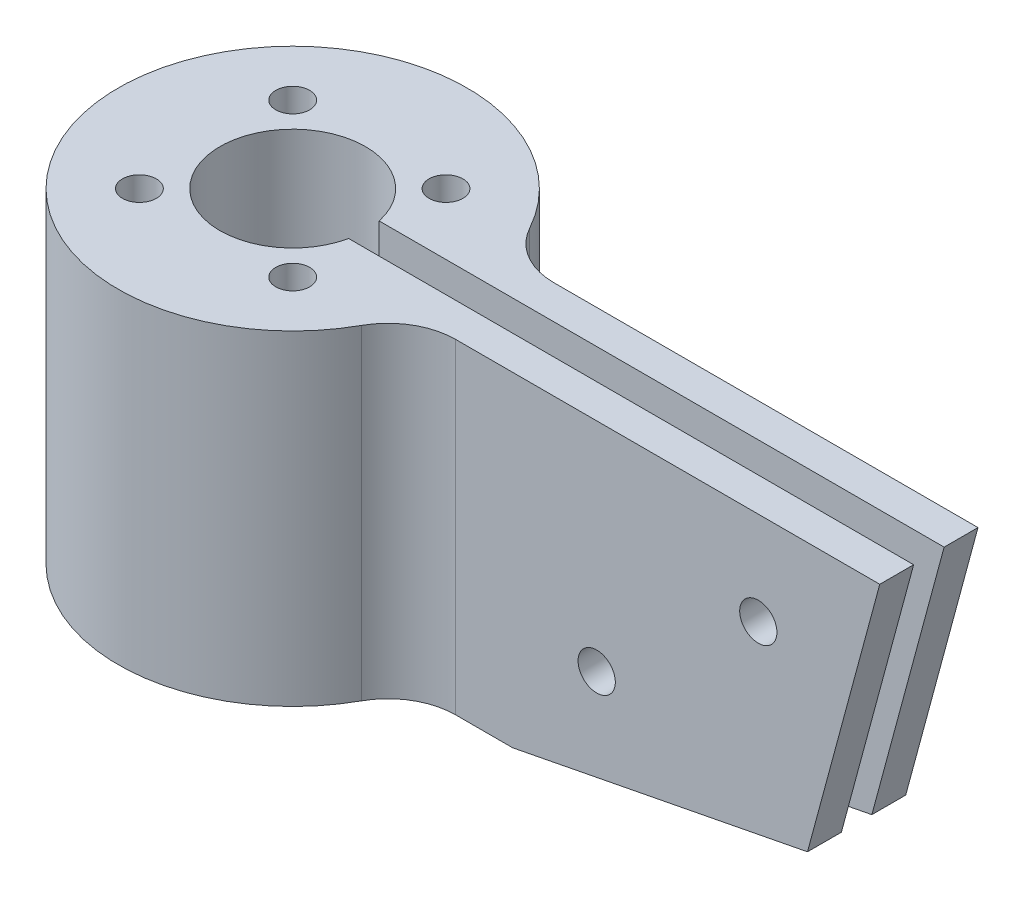
ISO-10303-21;
HEADER;
FILE_DESCRIPTION(('STEP AP214'),'2;1');
FILE_NAME('part.step','',(''),(''),'','','');
FILE_SCHEMA(('AUTOMOTIVE_DESIGN { 1 0 10303 214 1 1 1 1 }'));
ENDSEC;
DATA;
#1=APPLICATION_CONTEXT('core data for automotive mechanical design processes');
#2=APPLICATION_PROTOCOL_DEFINITION('international standard','automotive_design',2000,#1);
#3=PRODUCT_CONTEXT('',#1,'mechanical');
#4=PRODUCT('Part','Part','',(#3));
#5=PRODUCT_RELATED_PRODUCT_CATEGORY('part','',(#4));
#6=PRODUCT_DEFINITION_FORMATION('','',#4);
#7=PRODUCT_DEFINITION_CONTEXT('part definition',#1,'design');
#8=PRODUCT_DEFINITION('design','',#6,#7);
#9=PRODUCT_DEFINITION_SHAPE('','',#8);
#10=(LENGTH_UNIT() NAMED_UNIT(*) SI_UNIT(.MILLI.,.METRE.));
#11=(NAMED_UNIT(*) PLANE_ANGLE_UNIT() SI_UNIT($,.RADIAN.));
#12=(NAMED_UNIT(*) SI_UNIT($,.STERADIAN.) SOLID_ANGLE_UNIT());
#13=UNCERTAINTY_MEASURE_WITH_UNIT(LENGTH_MEASURE(1.E-05),#10,'distance_accuracy_value','');
#14=(GEOMETRIC_REPRESENTATION_CONTEXT(3) GLOBAL_UNCERTAINTY_ASSIGNED_CONTEXT((#13)) GLOBAL_UNIT_ASSIGNED_CONTEXT((#10,
#11,#12)) REPRESENTATION_CONTEXT('',''));
#15=CARTESIAN_POINT('',(0.,0.,0.));
#16=DIRECTION('',(0.,0.,1.));
#17=DIRECTION('',(1.,0.,0.));
#18=AXIS2_PLACEMENT_3D('',#15,#16,#17);
#19=CARTESIAN_POINT('',(0.,48.,0.));
#20=DIRECTION('',(0.,-1.,0.));
#21=DIRECTION('',(0.,0.,-1.));
#22=AXIS2_PLACEMENT_3D('',#19,#20,#21);
#23=CYLINDRICAL_SURFACE('',#22,10.75);
#24=CARTESIAN_POINT('',(0.,0.,0.));
#25=DIRECTION('',(0.,-1.,0.));
#26=DIRECTION('',(0.,0.,1.));
#27=AXIS2_PLACEMENT_3D('',#24,#25,#26);
#28=CIRCLE('',#27,10.75);
#29=CARTESIAN_POINT('',(10.5118980208143,0.,2.25));
#30=VERTEX_POINT('',#29);
#31=CARTESIAN_POINT('',(10.5118980208143,0.,-2.25));
#32=VERTEX_POINT('',#31);
#33=EDGE_CURVE('E198',#30,#32,#28,.T.);
#34=ORIENTED_EDGE('',*,*,#33,.T.);
#35=DIRECTION('',(0.,-1.,0.));
#36=VECTOR('',#35,1.);
#37=CARTESIAN_POINT('',(10.5118980208143,48.,-2.25));
#38=LINE('',#37,#36);
#39=CARTESIAN_POINT('',(10.5118980208143,48.,-2.25));
#40=VERTEX_POINT('',#39);
#41=EDGE_CURVE('E232',#40,#32,#38,.T.);
#42=ORIENTED_EDGE('',*,*,#41,.F.);
#43=CARTESIAN_POINT('',(0.,48.,0.));
#44=DIRECTION('',(0.,-1.,0.));
#45=DIRECTION('',(0.,0.,1.));
#46=AXIS2_PLACEMENT_3D('',#43,#44,#45);
#47=CIRCLE('',#46,10.75);
#48=CARTESIAN_POINT('',(10.5118980208143,48.,2.25));
#49=VERTEX_POINT('',#48);
#50=EDGE_CURVE('E130',#49,#40,#47,.T.);
#51=ORIENTED_EDGE('',*,*,#50,.F.);
#52=DIRECTION('',(0.,-1.,0.));
#53=VECTOR('',#52,1.);
#54=CARTESIAN_POINT('',(10.5118980208143,48.,2.25));
#55=LINE('',#54,#53);
#56=EDGE_CURVE('E211',#49,#30,#55,.T.);
#57=ORIENTED_EDGE('',*,*,#56,.T.);
#58=EDGE_LOOP('',(#34,#42,#51,#57));
#59=FACE_BOUND('',#58,.T.);
#60=ADVANCED_FACE('F35',(#59),#23,.F.);
#61=CARTESIAN_POINT('',(10.5118980208143,48.,-2.25));
#62=DIRECTION('',(0.,0.,-1.));
#63=DIRECTION('',(-1.,0.,0.));
#64=AXIS2_PLACEMENT_3D('',#61,#62,#63);
#65=PLANE('',#64);
#66=CARTESIAN_POINT('',(52.1236564536874,15.9580690922241,-2.25));
#67=DIRECTION('',(0.,0.,-1.));
#68=DIRECTION('',(-1.,0.,0.));
#69=AXIS2_PLACEMENT_3D('',#66,#67,#68);
#70=CIRCLE('',#69,2.75);
#71=CARTESIAN_POINT('',(49.3736564536874,15.9580690922241,-2.25));
#72=VERTEX_POINT('',#71);
#73=EDGE_CURVE('E255',#72,#72,#70,.T.);
#74=ORIENTED_EDGE('',*,*,#73,.T.);
#75=EDGE_LOOP('',(#74));
#76=FACE_BOUND('',#75,.T.);
#77=CARTESIAN_POINT('',(75.9780501365719,34.250087131701,-2.25));
#78=DIRECTION('',(0.,0.,-1.));
#79=DIRECTION('',(-1.,0.,0.));
#80=AXIS2_PLACEMENT_3D('',#77,#78,#79);
#81=CIRCLE('',#80,2.75000000000001);
#82=CARTESIAN_POINT('',(73.2280501365719,34.250087131701,-2.25));
#83=VERTEX_POINT('',#82);
#84=EDGE_CURVE('E155',#83,#83,#81,.T.);
#85=ORIENTED_EDGE('',*,*,#84,.T.);
#86=EDGE_LOOP('',(#85));
#87=FACE_BOUND('',#86,.T.);
#88=DIRECTION('',(1.,0.,0.));
#89=VECTOR('',#88,1.);
#90=CARTESIAN_POINT('',(10.5118980208143,0.,-2.25));
#91=LINE('',#90,#89);
#92=CARTESIAN_POINT('',(39.7082982012117,0.,-2.25));
#93=VERTEX_POINT('',#92);
#94=EDGE_CURVE('E214',#32,#93,#91,.T.);
#95=ORIENTED_EDGE('',*,*,#94,.T.);
#96=DIRECTION('',(-0.981627183447664,-0.190808995376546,0.));
#97=VECTOR('',#96,1.);
#98=CARTESIAN_POINT('',(1.44570260836241,-7.43749515974958,-2.25));
#99=LINE('',#98,#97);
#100=CARTESIAN_POINT('',(83.239372469083,8.46158367328585,-2.25));
#101=VERTEX_POINT('',#100);
#102=EDGE_CURVE('E144',#101,#93,#99,.T.);
#103=ORIENTED_EDGE('',*,*,#102,.F.);
#104=DIRECTION('',(-0.260538306569262,-0.965463510864093,0.));
#105=VECTOR('',#104,1.);
#106=CARTESIAN_POINT('',(75.4606377651394,-20.3636766741913,-2.25));
#107=LINE('',#106,#105);
#108=CARTESIAN_POINT('',(93.909140842797,48.,-2.24999999999999));
#109=VERTEX_POINT('',#108);
#110=EDGE_CURVE('E140',#109,#101,#107,.T.);
#111=ORIENTED_EDGE('',*,*,#110,.F.);
#112=DIRECTION('',(1.,0.,0.));
#113=VECTOR('',#112,1.);
#114=CARTESIAN_POINT('',(10.5118980208143,48.,-2.25));
#115=LINE('',#114,#113);
#116=EDGE_CURVE('E124',#40,#109,#115,.T.);
#117=ORIENTED_EDGE('',*,*,#116,.F.);
#118=ORIENTED_EDGE('',*,*,#41,.T.);
#119=EDGE_LOOP('',(#95,#103,#111,#117,#118));
#120=FACE_BOUND('',#119,.T.);
#121=ADVANCED_FACE('F147',(#76,#87,#120),#65,.F.);
#122=CARTESIAN_POINT('',(39.7082982012117,48.,-7.25));
#123=DIRECTION('',(0.,0.,1.));
#124=DIRECTION('',(1.,0.,0.));
#125=AXIS2_PLACEMENT_3D('',#122,#123,#124);
#126=PLANE('',#125);
#127=CARTESIAN_POINT('',(52.1236564536874,15.9580690922241,-7.25));
#128=DIRECTION('',(0.,0.,-1.));
#129=DIRECTION('',(-1.,0.,0.));
#130=AXIS2_PLACEMENT_3D('',#127,#128,#129);
#131=CIRCLE('',#130,2.75);
#132=CARTESIAN_POINT('',(49.3736564536874,15.9580690922241,-7.25));
#133=VERTEX_POINT('',#132);
#134=EDGE_CURVE('E265',#133,#133,#131,.T.);
#135=ORIENTED_EDGE('',*,*,#134,.F.);
#136=EDGE_LOOP('',(#135));
#137=FACE_BOUND('',#136,.T.);
#138=CARTESIAN_POINT('',(75.9780501365719,34.250087131701,-7.25));
#139=DIRECTION('',(0.,0.,-1.));
#140=DIRECTION('',(-1.,0.,0.));
#141=AXIS2_PLACEMENT_3D('',#138,#139,#140);
#142=CIRCLE('',#141,2.75000000000001);
#143=CARTESIAN_POINT('',(73.2280501365719,34.250087131701,-7.25));
#144=VERTEX_POINT('',#143);
#145=EDGE_CURVE('E250',#144,#144,#142,.T.);
#146=ORIENTED_EDGE('',*,*,#145,.F.);
#147=EDGE_LOOP('',(#146));
#148=FACE_BOUND('',#147,.T.);
#149=DIRECTION('',(-1.,0.,0.));
#150=VECTOR('',#149,1.);
#151=CARTESIAN_POINT('',(39.7082982012117,0.,-7.25));
#152=LINE('',#151,#150);
#153=CARTESIAN_POINT('',(39.7082982012117,0.,-7.25));
#154=VERTEX_POINT('',#153);
#155=CARTESIAN_POINT('',(31.3129366237023,0.,-7.25));
#156=VERTEX_POINT('',#155);
#157=EDGE_CURVE('E219',#154,#156,#152,.T.);
#158=ORIENTED_EDGE('',*,*,#157,.T.);
#159=DIRECTION('',(0.,1.,0.));
#160=VECTOR('',#159,1.);
#161=CARTESIAN_POINT('',(31.3129366237023,48.,-7.25));
#162=LINE('',#161,#160);
#163=CARTESIAN_POINT('',(31.3129366237023,48.,-7.25));
#164=VERTEX_POINT('',#163);
#165=EDGE_CURVE('E52',#156,#164,#162,.T.);
#166=ORIENTED_EDGE('',*,*,#165,.T.);
#167=DIRECTION('',(-1.,0.,0.));
#168=VECTOR('',#167,1.);
#169=CARTESIAN_POINT('',(39.7082982012117,48.,-7.25));
#170=LINE('',#169,#168);
#171=CARTESIAN_POINT('',(93.909140842797,48.,-7.24999999999999));
#172=VERTEX_POINT('',#171);
#173=EDGE_CURVE('E135',#172,#164,#170,.T.);
#174=ORIENTED_EDGE('',*,*,#173,.F.);
#175=DIRECTION('',(-0.260538306569262,-0.965463510864093,0.));
#176=VECTOR('',#175,1.);
#177=CARTESIAN_POINT('',(75.4606377651394,-20.3636766741913,-7.25));
#178=LINE('',#177,#176);
#179=CARTESIAN_POINT('',(83.239372469083,8.46158367328585,-7.25));
#180=VERTEX_POINT('',#179);
#181=EDGE_CURVE('E142',#172,#180,#178,.T.);
#182=ORIENTED_EDGE('',*,*,#181,.T.);
#183=DIRECTION('',(-0.981627183447664,-0.190808995376546,0.));
#184=VECTOR('',#183,1.);
#185=CARTESIAN_POINT('',(1.44570260836241,-7.43749515974958,-7.25));
#186=LINE('',#185,#184);
#187=EDGE_CURVE('E149',#180,#154,#186,.T.);
#188=ORIENTED_EDGE('',*,*,#187,.T.);
#189=EDGE_LOOP('',(#158,#166,#174,#182,#188));
#190=FACE_BOUND('',#189,.T.);
#191=ADVANCED_FACE('F306',(#137,#148,#190),#126,.F.);
#192=CARTESIAN_POINT('',(0.,48.,0.));
#193=DIRECTION('',(0.,-1.,0.));
#194=DIRECTION('',(0.,0.,-1.));
#195=AXIS2_PLACEMENT_3D('',#192,#193,#194);
#196=CYLINDRICAL_SURFACE('',#195,25.75);
#197=CARTESIAN_POINT('',(0.,0.,0.));
#198=DIRECTION('',(0.,1.,0.));
#199=DIRECTION('',(0.,0.,1.));
#200=AXIS2_PLACEMENT_3D('',#197,#198,#199);
#201=CIRCLE('',#200,25.75);
#202=CARTESIAN_POINT('',(22.5540732324569,0.,-12.4248251748252));
#203=VERTEX_POINT('',#202);
#204=CARTESIAN_POINT('',(22.5540732324569,0.,12.4248251748252));
#205=VERTEX_POINT('',#204);
#206=EDGE_CURVE('E221',#203,#205,#201,.T.);
#207=ORIENTED_EDGE('',*,*,#206,.T.);
#208=DIRECTION('',(0.,-1.,0.));
#209=VECTOR('',#208,1.);
#210=CARTESIAN_POINT('',(22.5540732324569,48.,12.4248251748252));
#211=LINE('',#210,#209);
#212=CARTESIAN_POINT('',(22.5540732324569,48.,12.4248251748252));
#213=VERTEX_POINT('',#212);
#214=EDGE_CURVE('E240',#205,#213,#211,.F.);
#215=ORIENTED_EDGE('',*,*,#214,.T.);
#216=CARTESIAN_POINT('',(0.,48.,0.));
#217=DIRECTION('',(0.,1.,0.));
#218=DIRECTION('',(0.,0.,1.));
#219=AXIS2_PLACEMENT_3D('',#216,#217,#218);
#220=CIRCLE('',#219,25.75);
#221=CARTESIAN_POINT('',(22.5540732324569,48.,-12.4248251748252));
#222=VERTEX_POINT('',#221);
#223=EDGE_CURVE('E204',#222,#213,#220,.T.);
#224=ORIENTED_EDGE('',*,*,#223,.F.);
#225=DIRECTION('',(0.,-1.,0.));
#226=VECTOR('',#225,1.);
#227=CARTESIAN_POINT('',(22.5540732324569,48.,-12.4248251748252));
#228=LINE('',#227,#226);
#229=EDGE_CURVE('E237',#222,#203,#228,.T.);
#230=ORIENTED_EDGE('',*,*,#229,.T.);
#231=EDGE_LOOP('',(#207,#215,#224,#230));
#232=FACE_BOUND('',#231,.T.);
#233=ADVANCED_FACE('F285',(#232),#196,.T.);
#234=CARTESIAN_POINT('',(39.7082982012117,48.,7.25));
#235=DIRECTION('',(0.,0.,-1.));
#236=DIRECTION('',(-1.,0.,0.));
#237=AXIS2_PLACEMENT_3D('',#234,#235,#236);
#238=PLANE('',#237);
#239=CARTESIAN_POINT('',(52.1236564536874,15.9580690922241,7.25));
#240=DIRECTION('',(0.,0.,-1.));
#241=DIRECTION('',(-1.,0.,0.));
#242=AXIS2_PLACEMENT_3D('',#239,#240,#241);
#243=CIRCLE('',#242,2.75);
#244=CARTESIAN_POINT('',(49.3736564536874,15.9580690922241,7.25));
#245=VERTEX_POINT('',#244);
#246=EDGE_CURVE('E260',#245,#245,#243,.T.);
#247=ORIENTED_EDGE('',*,*,#246,.T.);
#248=EDGE_LOOP('',(#247));
#249=FACE_BOUND('',#248,.T.);
#250=CARTESIAN_POINT('',(75.9780501365719,34.250087131701,7.25));
#251=DIRECTION('',(0.,0.,-1.));
#252=DIRECTION('',(-1.,0.,0.));
#253=AXIS2_PLACEMENT_3D('',#250,#251,#252);
#254=CIRCLE('',#253,2.75000000000001);
#255=CARTESIAN_POINT('',(73.2280501365719,34.250087131701,7.25));
#256=VERTEX_POINT('',#255);
#257=EDGE_CURVE('E249',#256,#256,#254,.T.);
#258=ORIENTED_EDGE('',*,*,#257,.T.);
#259=EDGE_LOOP('',(#258));
#260=FACE_BOUND('',#259,.T.);
#261=DIRECTION('',(1.,0.,0.));
#262=VECTOR('',#261,1.);
#263=CARTESIAN_POINT('',(39.7082982012117,48.,7.25));
#264=LINE('',#263,#262);
#265=CARTESIAN_POINT('',(31.3129366237023,48.,7.25));
#266=VERTEX_POINT('',#265);
#267=CARTESIAN_POINT('',(93.909140842797,48.,7.25));
#268=VERTEX_POINT('',#267);
#269=EDGE_CURVE('E207',#266,#268,#264,.T.);
#270=ORIENTED_EDGE('',*,*,#269,.F.);
#271=DIRECTION('',(0.,1.,0.));
#272=VECTOR('',#271,1.);
#273=CARTESIAN_POINT('',(31.3129366237023,0.,7.25));
#274=LINE('',#273,#272);
#275=CARTESIAN_POINT('',(31.3129366237023,0.,7.25));
#276=VERTEX_POINT('',#275);
#277=EDGE_CURVE('E234',#266,#276,#274,.F.);
#278=ORIENTED_EDGE('',*,*,#277,.T.);
#279=DIRECTION('',(1.,0.,0.));
#280=VECTOR('',#279,1.);
#281=CARTESIAN_POINT('',(39.7082982012117,0.,7.25));
#282=LINE('',#281,#280);
#283=CARTESIAN_POINT('',(39.7082982012117,0.,7.25));
#284=VERTEX_POINT('',#283);
#285=EDGE_CURVE('E224',#276,#284,#282,.T.);
#286=ORIENTED_EDGE('',*,*,#285,.T.);
#287=DIRECTION('',(0.981627183447664,0.190808995376546,0.));
#288=VECTOR('',#287,1.);
#289=CARTESIAN_POINT('',(39.7082982012117,0.,7.25));
#290=LINE('',#289,#288);
#291=CARTESIAN_POINT('',(83.239372469083,8.46158367328585,7.25));
#292=VERTEX_POINT('',#291);
#293=EDGE_CURVE('E159',#284,#292,#290,.T.);
#294=ORIENTED_EDGE('',*,*,#293,.T.);
#295=DIRECTION('',(0.260538306569262,0.965463510864093,0.));
#296=VECTOR('',#295,1.);
#297=CARTESIAN_POINT('',(83.239372469083,8.46158367328585,7.25));
#298=LINE('',#297,#296);
#299=EDGE_CURVE('E167',#292,#268,#298,.T.);
#300=ORIENTED_EDGE('',*,*,#299,.T.);
#301=EDGE_LOOP('',(#270,#278,#286,#294,#300));
#302=FACE_BOUND('',#301,.T.);
#303=ADVANCED_FACE('F282',(#249,#260,#302),#238,.F.);
#304=CARTESIAN_POINT('',(10.5118980208143,48.,2.25));
#305=DIRECTION('',(0.,0.,1.));
#306=DIRECTION('',(1.,0.,0.));
#307=AXIS2_PLACEMENT_3D('',#304,#305,#306);
#308=PLANE('',#307);
#309=CARTESIAN_POINT('',(52.1236564536874,15.9580690922241,2.25));
#310=DIRECTION('',(0.,0.,1.));
#311=DIRECTION('',(1.,0.,0.));
#312=AXIS2_PLACEMENT_3D('',#309,#310,#311);
#313=CIRCLE('',#312,2.75);
#314=CARTESIAN_POINT('',(54.8736564536874,15.9580690922241,2.25));
#315=VERTEX_POINT('',#314);
#316=EDGE_CURVE('E39',#315,#315,#313,.T.);
#317=ORIENTED_EDGE('',*,*,#316,.T.);
#318=EDGE_LOOP('',(#317));
#319=FACE_BOUND('',#318,.T.);
#320=CARTESIAN_POINT('',(75.9780501365719,34.250087131701,2.25));
#321=DIRECTION('',(0.,0.,1.));
#322=DIRECTION('',(1.,0.,0.));
#323=AXIS2_PLACEMENT_3D('',#320,#321,#322);
#324=CIRCLE('',#323,2.75000000000001);
#325=CARTESIAN_POINT('',(78.7280501365719,34.250087131701,2.25));
#326=VERTEX_POINT('',#325);
#327=EDGE_CURVE('E247',#326,#326,#324,.T.);
#328=ORIENTED_EDGE('',*,*,#327,.T.);
#329=EDGE_LOOP('',(#328));
#330=FACE_BOUND('',#329,.T.);
#331=DIRECTION('',(-1.,0.,0.));
#332=VECTOR('',#331,1.);
#333=CARTESIAN_POINT('',(10.5118980208143,0.,2.25));
#334=LINE('',#333,#332);
#335=CARTESIAN_POINT('',(39.7082982012117,0.,2.25));
#336=VERTEX_POINT('',#335);
#337=EDGE_CURVE('E201',#336,#30,#334,.T.);
#338=ORIENTED_EDGE('',*,*,#337,.T.);
#339=ORIENTED_EDGE('',*,*,#56,.F.);
#340=DIRECTION('',(-1.,0.,0.));
#341=VECTOR('',#340,1.);
#342=CARTESIAN_POINT('',(10.5118980208143,48.,2.25));
#343=LINE('',#342,#341);
#344=CARTESIAN_POINT('',(93.909140842797,48.,2.25));
#345=VERTEX_POINT('',#344);
#346=EDGE_CURVE('E209',#345,#49,#343,.T.);
#347=ORIENTED_EDGE('',*,*,#346,.F.);
#348=DIRECTION('',(-0.260538306569262,-0.965463510864093,0.));
#349=VECTOR('',#348,1.);
#350=CARTESIAN_POINT('',(83.239372469083,8.46158367328585,2.25));
#351=LINE('',#350,#349);
#352=CARTESIAN_POINT('',(83.239372469083,8.46158367328585,2.25));
#353=VERTEX_POINT('',#352);
#354=EDGE_CURVE('E161',#345,#353,#351,.T.);
#355=ORIENTED_EDGE('',*,*,#354,.T.);
#356=DIRECTION('',(-0.981627183447664,-0.190808995376546,0.));
#357=VECTOR('',#356,1.);
#358=CARTESIAN_POINT('',(39.7082982012117,0.,2.25));
#359=LINE('',#358,#357);
#360=EDGE_CURVE('E163',#353,#336,#359,.T.);
#361=ORIENTED_EDGE('',*,*,#360,.T.);
#362=EDGE_LOOP('',(#338,#339,#347,#355,#361));
#363=FACE_BOUND('',#362,.T.);
#364=ADVANCED_FACE('F272',(#319,#330,#363),#308,.F.);
#365=CARTESIAN_POINT('',(0.,48.,0.));
#366=DIRECTION('',(0.,1.,0.));
#367=DIRECTION('',(0.,0.,1.));
#368=AXIS2_PLACEMENT_3D('',#365,#366,#367);
#369=PLANE('',#368);
#370=CARTESIAN_POINT('',(-11.3137084989847,48.,11.3137084989848));
#371=DIRECTION('',(0.,1.,0.));
#372=DIRECTION('',(0.,0.,1.));
#373=AXIS2_PLACEMENT_3D('',#370,#371,#372);
#374=CIRCLE('',#373,2.5);
#375=CARTESIAN_POINT('',(-11.3137084989847,48.,13.8137084989848));
#376=VERTEX_POINT('',#375);
#377=EDGE_CURVE('E181',#376,#376,#374,.T.);
#378=ORIENTED_EDGE('',*,*,#377,.F.);
#379=EDGE_LOOP('',(#378));
#380=FACE_BOUND('',#379,.T.);
#381=CARTESIAN_POINT('',(11.3137084989847,48.,11.3137084989848));
#382=DIRECTION('',(0.,1.,0.));
#383=DIRECTION('',(0.,0.,1.));
#384=AXIS2_PLACEMENT_3D('',#381,#382,#383);
#385=CIRCLE('',#384,2.5);
#386=CARTESIAN_POINT('',(11.3137084989847,48.,13.8137084989848));
#387=VERTEX_POINT('',#386);
#388=EDGE_CURVE('E187',#387,#387,#385,.T.);
#389=ORIENTED_EDGE('',*,*,#388,.F.);
#390=EDGE_LOOP('',(#389));
#391=FACE_BOUND('',#390,.T.);
#392=CARTESIAN_POINT('',(11.3137084989847,48.,-11.3137084989848));
#393=DIRECTION('',(0.,1.,0.));
#394=DIRECTION('',(0.,0.,1.));
#395=AXIS2_PLACEMENT_3D('',#392,#393,#394);
#396=CIRCLE('',#395,2.5);
#397=CARTESIAN_POINT('',(11.3137084989847,48.,-8.81370849898479));
#398=VERTEX_POINT('',#397);
#399=EDGE_CURVE('E176',#398,#398,#396,.T.);
#400=ORIENTED_EDGE('',*,*,#399,.F.);
#401=EDGE_LOOP('',(#400));
#402=FACE_BOUND('',#401,.T.);
#403=CARTESIAN_POINT('',(-11.3137084989848,48.,-11.3137084989847));
#404=DIRECTION('',(0.,1.,0.));
#405=DIRECTION('',(0.,0.,1.));
#406=AXIS2_PLACEMENT_3D('',#403,#404,#405);
#407=CIRCLE('',#406,2.5);
#408=CARTESIAN_POINT('',(-11.3137084989848,48.,-8.81370849898474));
#409=VERTEX_POINT('',#408);
#410=EDGE_CURVE('E180',#409,#409,#407,.T.);
#411=ORIENTED_EDGE('',*,*,#410,.F.);
#412=EDGE_LOOP('',(#411));
#413=FACE_BOUND('',#412,.T.);
#414=ORIENTED_EDGE('',*,*,#50,.T.);
#415=ORIENTED_EDGE('',*,*,#116,.T.);
#416=DIRECTION('',(0.,0.,-1.));
#417=VECTOR('',#416,1.);
#418=CARTESIAN_POINT('',(93.909140842797,48.,-2.24999999999999));
#419=LINE('',#418,#417);
#420=EDGE_CURVE('E127',#109,#172,#419,.T.);
#421=ORIENTED_EDGE('',*,*,#420,.T.);
#422=ORIENTED_EDGE('',*,*,#173,.T.);
#423=CARTESIAN_POINT('',(31.3129366237023,48.,-17.25));
#424=DIRECTION('',(0.,1.,0.));
#425=DIRECTION('',(0.,0.,1.));
#426=AXIS2_PLACEMENT_3D('',#423,#424,#425);
#427=CIRCLE('',#426,10.);
#428=EDGE_CURVE('E11',#164,#222,#427,.F.);
#429=ORIENTED_EDGE('',*,*,#428,.T.);
#430=ORIENTED_EDGE('',*,*,#223,.T.);
#431=CARTESIAN_POINT('',(31.3129366237023,48.,17.25));
#432=DIRECTION('',(0.,1.,0.));
#433=DIRECTION('',(0.,0.,1.));
#434=AXIS2_PLACEMENT_3D('',#431,#432,#433);
#435=CIRCLE('',#434,10.);
#436=EDGE_CURVE('E245',#213,#266,#435,.F.);
#437=ORIENTED_EDGE('',*,*,#436,.T.);
#438=ORIENTED_EDGE('',*,*,#269,.T.);
#439=DIRECTION('',(0.,0.,1.));
#440=VECTOR('',#439,1.);
#441=CARTESIAN_POINT('',(93.909140842797,48.,-70.1498020926708));
#442=LINE('',#441,#440);
#443=EDGE_CURVE('E164',#345,#268,#442,.T.);
#444=ORIENTED_EDGE('',*,*,#443,.F.);
#445=ORIENTED_EDGE('',*,*,#346,.T.);
#446=EDGE_LOOP('',(#414,#415,#421,#422,#429,#430,#437,#438,#444,#445));
#447=FACE_BOUND('',#446,.T.);
#448=ADVANCED_FACE('F126',(#380,#391,#402,#413,#447),#369,.T.);
#449=CARTESIAN_POINT('',(0.,0.,0.));
#450=DIRECTION('',(0.,1.,0.));
#451=DIRECTION('',(0.,0.,1.));
#452=AXIS2_PLACEMENT_3D('',#449,#450,#451);
#453=PLANE('',#452);
#454=ORIENTED_EDGE('',*,*,#33,.F.);
#455=ORIENTED_EDGE('',*,*,#337,.F.);
#456=DIRECTION('',(0.,0.,-1.));
#457=VECTOR('',#456,1.);
#458=CARTESIAN_POINT('',(39.7082982012117,0.,2.25));
#459=LINE('',#458,#457);
#460=EDGE_CURVE('E226',#284,#336,#459,.T.);
#461=ORIENTED_EDGE('',*,*,#460,.F.);
#462=ORIENTED_EDGE('',*,*,#285,.F.);
#463=CARTESIAN_POINT('',(31.3129366237023,0.,17.25));
#464=DIRECTION('',(0.,1.,0.));
#465=DIRECTION('',(0.,0.,1.));
#466=AXIS2_PLACEMENT_3D('',#463,#464,#465);
#467=CIRCLE('',#466,10.);
#468=EDGE_CURVE('E243',#276,#205,#467,.T.);
#469=ORIENTED_EDGE('',*,*,#468,.T.);
#470=ORIENTED_EDGE('',*,*,#206,.F.);
#471=CARTESIAN_POINT('',(31.3129366237023,0.,-17.25));
#472=DIRECTION('',(0.,1.,0.));
#473=DIRECTION('',(0.,0.,1.));
#474=AXIS2_PLACEMENT_3D('',#471,#472,#473);
#475=CIRCLE('',#474,10.);
#476=EDGE_CURVE('E44',#203,#156,#475,.T.);
#477=ORIENTED_EDGE('',*,*,#476,.T.);
#478=ORIENTED_EDGE('',*,*,#157,.F.);
#479=DIRECTION('',(0.,0.,-1.));
#480=VECTOR('',#479,1.);
#481=CARTESIAN_POINT('',(39.7082982012117,0.,-2.25));
#482=LINE('',#481,#480);
#483=EDGE_CURVE('E216',#93,#154,#482,.T.);
#484=ORIENTED_EDGE('',*,*,#483,.F.);
#485=ORIENTED_EDGE('',*,*,#94,.F.);
#486=EDGE_LOOP('',(#454,#455,#461,#462,#469,#470,#477,#478,#484,#485));
#487=FACE_BOUND('',#486,.T.);
#488=ADVANCED_FACE('F299',(#487),#453,.F.);
#489=CARTESIAN_POINT('',(31.3129366237023,48.,17.25));
#490=DIRECTION('',(0.,-1.,0.));
#491=DIRECTION('',(0.,0.,-1.));
#492=AXIS2_PLACEMENT_3D('',#489,#490,#491);
#493=CYLINDRICAL_SURFACE('',#492,10.);
#494=ORIENTED_EDGE('',*,*,#436,.F.);
#495=ORIENTED_EDGE('',*,*,#214,.F.);
#496=ORIENTED_EDGE('',*,*,#468,.F.);
#497=ORIENTED_EDGE('',*,*,#277,.F.);
#498=EDGE_LOOP('',(#494,#495,#496,#497));
#499=FACE_BOUND('',#498,.T.);
#500=ADVANCED_FACE('F296',(#499),#493,.F.);
#501=CARTESIAN_POINT('',(31.3129366237023,48.,-17.25));
#502=DIRECTION('',(0.,-1.,0.));
#503=DIRECTION('',(0.,0.,-1.));
#504=AXIS2_PLACEMENT_3D('',#501,#502,#503);
#505=CYLINDRICAL_SURFACE('',#504,10.);
#506=ORIENTED_EDGE('',*,*,#428,.F.);
#507=ORIENTED_EDGE('',*,*,#165,.F.);
#508=ORIENTED_EDGE('',*,*,#476,.F.);
#509=ORIENTED_EDGE('',*,*,#229,.F.);
#510=EDGE_LOOP('',(#506,#507,#508,#509));
#511=FACE_BOUND('',#510,.T.);
#512=ADVANCED_FACE('F37',(#511),#505,.F.);
#513=CARTESIAN_POINT('',(-11.3137084989848,38.,-11.3137084989847));
#514=DIRECTION('',(0.,1.,0.));
#515=DIRECTION('',(0.,0.,1.));
#516=AXIS2_PLACEMENT_3D('',#513,#514,#515);
#517=CYLINDRICAL_SURFACE('',#516,2.5);
#518=CARTESIAN_POINT('',(-11.3137084989848,38.,-11.3137084989847));
#519=DIRECTION('',(0.,1.,0.));
#520=DIRECTION('',(0.,0.,1.));
#521=AXIS2_PLACEMENT_3D('',#518,#519,#520);
#522=CIRCLE('',#521,2.5);
#523=CARTESIAN_POINT('',(-11.3137084989848,38.,-8.81370849898474));
#524=VERTEX_POINT('',#523);
#525=EDGE_CURVE('E195',#524,#524,#522,.T.);
#526=ORIENTED_EDGE('',*,*,#525,.F.);
#527=EDGE_LOOP('',(#526));
#528=FACE_BOUND('',#527,.T.);
#529=ORIENTED_EDGE('',*,*,#410,.T.);
#530=EDGE_LOOP('',(#529));
#531=FACE_BOUND('',#530,.T.);
#532=ADVANCED_FACE('F347',(#528,#531),#517,.F.);
#533=CARTESIAN_POINT('',(-11.3137084989848,38.,-11.3137084989847));
#534=DIRECTION('',(0.,1.,0.));
#535=DIRECTION('',(0.,0.,1.));
#536=AXIS2_PLACEMENT_3D('',#533,#534,#535);
#537=PLANE('',#536);
#538=ORIENTED_EDGE('',*,*,#525,.T.);
#539=EDGE_LOOP('',(#538));
#540=FACE_BOUND('',#539,.T.);
#541=ADVANCED_FACE('F501',(#540),#537,.T.);
#542=CARTESIAN_POINT('',(11.3137084989847,38.,-11.3137084989848));
#543=DIRECTION('',(0.,1.,0.));
#544=DIRECTION('',(0.,0.,1.));
#545=AXIS2_PLACEMENT_3D('',#542,#543,#544);
#546=CYLINDRICAL_SURFACE('',#545,2.5);
#547=CARTESIAN_POINT('',(11.3137084989847,38.,-11.3137084989848));
#548=DIRECTION('',(0.,1.,0.));
#549=DIRECTION('',(0.,0.,1.));
#550=AXIS2_PLACEMENT_3D('',#547,#548,#549);
#551=CIRCLE('',#550,2.5);
#552=CARTESIAN_POINT('',(11.3137084989847,38.,-8.81370849898479));
#553=VERTEX_POINT('',#552);
#554=EDGE_CURVE('E190',#553,#553,#551,.T.);
#555=ORIENTED_EDGE('',*,*,#554,.F.);
#556=EDGE_LOOP('',(#555));
#557=FACE_BOUND('',#556,.T.);
#558=ORIENTED_EDGE('',*,*,#399,.T.);
#559=EDGE_LOOP('',(#558));
#560=FACE_BOUND('',#559,.T.);
#561=ADVANCED_FACE('F491',(#557,#560),#546,.F.);
#562=CARTESIAN_POINT('',(11.3137084989847,38.,-11.3137084989848));
#563=DIRECTION('',(0.,1.,0.));
#564=DIRECTION('',(0.,0.,1.));
#565=AXIS2_PLACEMENT_3D('',#562,#563,#564);
#566=PLANE('',#565);
#567=ORIENTED_EDGE('',*,*,#554,.T.);
#568=EDGE_LOOP('',(#567));
#569=FACE_BOUND('',#568,.T.);
#570=ADVANCED_FACE('F481',(#569),#566,.T.);
#571=CARTESIAN_POINT('',(11.3137084989847,38.,11.3137084989848));
#572=DIRECTION('',(0.,1.,0.));
#573=DIRECTION('',(0.,0.,1.));
#574=AXIS2_PLACEMENT_3D('',#571,#572,#573);
#575=CYLINDRICAL_SURFACE('',#574,2.5);
#576=CARTESIAN_POINT('',(11.3137084989847,38.,11.3137084989848));
#577=DIRECTION('',(0.,1.,0.));
#578=DIRECTION('',(0.,0.,1.));
#579=AXIS2_PLACEMENT_3D('',#576,#577,#578);
#580=CIRCLE('',#579,2.5);
#581=CARTESIAN_POINT('',(11.3137084989847,38.,13.8137084989848));
#582=VERTEX_POINT('',#581);
#583=EDGE_CURVE('E184',#582,#582,#580,.T.);
#584=ORIENTED_EDGE('',*,*,#583,.F.);
#585=EDGE_LOOP('',(#584));
#586=FACE_BOUND('',#585,.T.);
#587=ORIENTED_EDGE('',*,*,#388,.T.);
#588=EDGE_LOOP('',(#587));
#589=FACE_BOUND('',#588,.T.);
#590=ADVANCED_FACE('F471',(#586,#589),#575,.F.);
#591=CARTESIAN_POINT('',(11.3137084989847,38.,11.3137084989848));
#592=DIRECTION('',(0.,1.,0.));
#593=DIRECTION('',(0.,0.,1.));
#594=AXIS2_PLACEMENT_3D('',#591,#592,#593);
#595=PLANE('',#594);
#596=ORIENTED_EDGE('',*,*,#583,.T.);
#597=EDGE_LOOP('',(#596));
#598=FACE_BOUND('',#597,.T.);
#599=ADVANCED_FACE('F461',(#598),#595,.T.);
#600=CARTESIAN_POINT('',(-11.3137084989847,38.,11.3137084989848));
#601=DIRECTION('',(0.,1.,0.));
#602=DIRECTION('',(0.,0.,1.));
#603=AXIS2_PLACEMENT_3D('',#600,#601,#602);
#604=CYLINDRICAL_SURFACE('',#603,2.5);
#605=CARTESIAN_POINT('',(-11.3137084989847,38.,11.3137084989848));
#606=DIRECTION('',(0.,1.,0.));
#607=DIRECTION('',(0.,0.,1.));
#608=AXIS2_PLACEMENT_3D('',#605,#606,#607);
#609=CIRCLE('',#608,2.5);
#610=CARTESIAN_POINT('',(-11.3137084989847,38.,13.8137084989848));
#611=VERTEX_POINT('',#610);
#612=EDGE_CURVE('E177',#611,#611,#609,.T.);
#613=ORIENTED_EDGE('',*,*,#612,.F.);
#614=EDGE_LOOP('',(#613));
#615=FACE_BOUND('',#614,.T.);
#616=ORIENTED_EDGE('',*,*,#377,.T.);
#617=EDGE_LOOP('',(#616));
#618=FACE_BOUND('',#617,.T.);
#619=ADVANCED_FACE('F330',(#615,#618),#604,.F.);
#620=CARTESIAN_POINT('',(-11.3137084989847,38.,11.3137084989848));
#621=DIRECTION('',(0.,1.,0.));
#622=DIRECTION('',(0.,0.,1.));
#623=AXIS2_PLACEMENT_3D('',#620,#621,#622);
#624=PLANE('',#623);
#625=ORIENTED_EDGE('',*,*,#612,.T.);
#626=EDGE_LOOP('',(#625));
#627=FACE_BOUND('',#626,.T.);
#628=ADVANCED_FACE('F323',(#627),#624,.T.);
#629=CARTESIAN_POINT('',(83.239372469083,8.46158367328585,-70.1498020926708));
#630=DIRECTION('',(0.965463510864093,-0.260538306569262,0.));
#631=DIRECTION('',(0.260538306569262,0.965463510864093,0.));
#632=AXIS2_PLACEMENT_3D('',#629,#630,#631);
#633=PLANE('',#632);
#634=ORIENTED_EDGE('',*,*,#354,.F.);
#635=ORIENTED_EDGE('',*,*,#443,.T.);
#636=ORIENTED_EDGE('',*,*,#299,.F.);
#637=DIRECTION('',(0.,0.,1.));
#638=VECTOR('',#637,1.);
#639=CARTESIAN_POINT('',(83.239372469083,8.46158367328585,-70.1498020926708));
#640=LINE('',#639,#638);
#641=EDGE_CURVE('E170',#353,#292,#640,.T.);
#642=ORIENTED_EDGE('',*,*,#641,.F.);
#643=EDGE_LOOP('',(#634,#635,#636,#642));
#644=FACE_BOUND('',#643,.T.);
#645=ADVANCED_FACE('F321',(#644),#633,.T.);
#646=CARTESIAN_POINT('',(39.7082982012117,0.,-70.1498020926708));
#647=DIRECTION('',(0.190808995376546,-0.981627183447664,0.));
#648=DIRECTION('',(0.981627183447664,0.190808995376546,0.));
#649=AXIS2_PLACEMENT_3D('',#646,#647,#648);
#650=PLANE('',#649);
#651=ORIENTED_EDGE('',*,*,#360,.F.);
#652=ORIENTED_EDGE('',*,*,#641,.T.);
#653=ORIENTED_EDGE('',*,*,#293,.F.);
#654=ORIENTED_EDGE('',*,*,#460,.T.);
#655=EDGE_LOOP('',(#651,#652,#653,#654));
#656=FACE_BOUND('',#655,.T.);
#657=ADVANCED_FACE('F318',(#656),#650,.T.);
#658=CARTESIAN_POINT('',(1.44570260836241,-7.43749515974958,-2.25));
#659=DIRECTION('',(0.190808995376546,-0.981627183447664,0.));
#660=DIRECTION('',(0.981627183447664,0.190808995376546,0.));
#661=AXIS2_PLACEMENT_3D('',#658,#659,#660);
#662=PLANE('',#661);
#663=ORIENTED_EDGE('',*,*,#187,.F.);
#664=DIRECTION('',(0.,0.,-1.));
#665=VECTOR('',#664,1.);
#666=CARTESIAN_POINT('',(83.239372469083,8.46158367328585,-2.25));
#667=LINE('',#666,#665);
#668=EDGE_CURVE('E143',#101,#180,#667,.T.);
#669=ORIENTED_EDGE('',*,*,#668,.F.);
#670=ORIENTED_EDGE('',*,*,#102,.T.);
#671=ORIENTED_EDGE('',*,*,#483,.T.);
#672=EDGE_LOOP('',(#663,#669,#670,#671));
#673=FACE_BOUND('',#672,.T.);
#674=ADVANCED_FACE('F309',(#673),#662,.T.);
#675=CARTESIAN_POINT('',(75.4606377651394,-20.3636766741913,-2.25));
#676=DIRECTION('',(0.965463510864093,-0.260538306569262,0.));
#677=DIRECTION('',(0.260538306569262,0.965463510864093,0.));
#678=AXIS2_PLACEMENT_3D('',#675,#676,#677);
#679=PLANE('',#678);
#680=ORIENTED_EDGE('',*,*,#181,.F.);
#681=ORIENTED_EDGE('',*,*,#420,.F.);
#682=ORIENTED_EDGE('',*,*,#110,.T.);
#683=ORIENTED_EDGE('',*,*,#668,.T.);
#684=EDGE_LOOP('',(#680,#681,#682,#683));
#685=FACE_BOUND('',#684,.T.);
#686=ADVANCED_FACE('F139',(#685),#679,.T.);
#687=CARTESIAN_POINT('',(75.9780501365719,34.250087131701,19.75));
#688=DIRECTION('',(0.,0.,-1.));
#689=DIRECTION('',(-1.,0.,0.));
#690=AXIS2_PLACEMENT_3D('',#687,#688,#689);
#691=CYLINDRICAL_SURFACE('',#690,2.75000000000001);
#692=ORIENTED_EDGE('',*,*,#327,.F.);
#693=EDGE_LOOP('',(#692));
#694=FACE_BOUND('',#693,.T.);
#695=ORIENTED_EDGE('',*,*,#257,.F.);
#696=EDGE_LOOP('',(#695));
#697=FACE_BOUND('',#696,.T.);
#698=ADVANCED_FACE('F409',(#694,#697),#691,.F.);
#699=ORIENTED_EDGE('',*,*,#145,.T.);
#700=EDGE_LOOP('',(#699));
#701=FACE_BOUND('',#700,.T.);
#702=ORIENTED_EDGE('',*,*,#84,.F.);
#703=EDGE_LOOP('',(#702));
#704=FACE_BOUND('',#703,.T.);
#705=ADVANCED_FACE('F278',(#701,#704),#691,.F.);
#706=CARTESIAN_POINT('',(52.1236564536874,15.9580690922241,19.75));
#707=DIRECTION('',(0.,0.,-1.));
#708=DIRECTION('',(-1.,0.,0.));
#709=AXIS2_PLACEMENT_3D('',#706,#707,#708);
#710=CYLINDRICAL_SURFACE('',#709,2.75);
#711=ORIENTED_EDGE('',*,*,#316,.F.);
#712=EDGE_LOOP('',(#711));
#713=FACE_BOUND('',#712,.T.);
#714=ORIENTED_EDGE('',*,*,#246,.F.);
#715=EDGE_LOOP('',(#714));
#716=FACE_BOUND('',#715,.T.);
#717=ADVANCED_FACE('F274',(#713,#716),#710,.F.);
#718=ORIENTED_EDGE('',*,*,#134,.T.);
#719=EDGE_LOOP('',(#718));
#720=FACE_BOUND('',#719,.T.);
#721=ORIENTED_EDGE('',*,*,#73,.F.);
#722=EDGE_LOOP('',(#721));
#723=FACE_BOUND('',#722,.T.);
#724=ADVANCED_FACE('F277',(#720,#723),#710,.F.);
#725=CLOSED_SHELL('',(#60,#121,#191,#233,#303,#364,#448,#488,#500,#512,#532,#541,#561,#570,#590,
#599,#619,#628,#645,#657,#674,#686,#698,#705,#717,#724));
#726=MANIFOLD_SOLID_BREP('B2',#725);
#727=ADVANCED_BREP_SHAPE_REPRESENTATION('',(#18,#726),#14);
#728=SHAPE_DEFINITION_REPRESENTATION(#9,#727);
ENDSEC;
END-ISO-10303-21;
